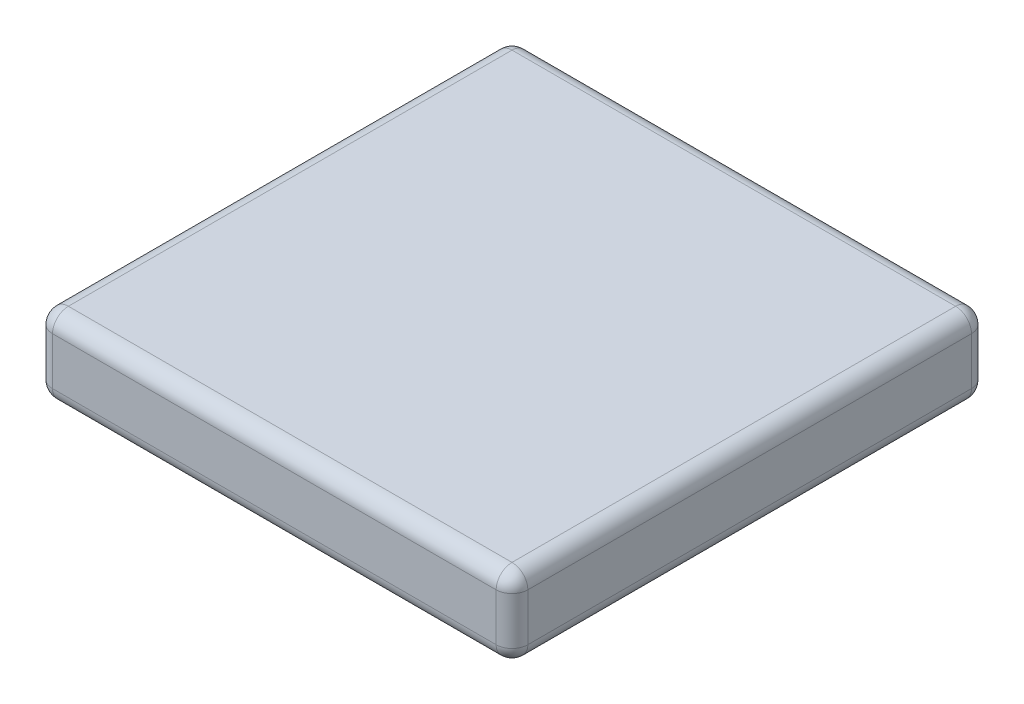
ISO-10303-21;
HEADER;
FILE_DESCRIPTION(('STEP AP214'),'2;1');
FILE_NAME('part.step','',(''),(''),'','','');
FILE_SCHEMA(('AUTOMOTIVE_DESIGN { 1 0 10303 214 1 1 1 1 }'));
ENDSEC;
DATA;
#1=APPLICATION_CONTEXT('core data for automotive mechanical design processes');
#2=APPLICATION_PROTOCOL_DEFINITION('international standard','automotive_design',2000,#1);
#3=PRODUCT_CONTEXT('',#1,'mechanical');
#4=PRODUCT('Part','Part','',(#3));
#5=PRODUCT_RELATED_PRODUCT_CATEGORY('part','',(#4));
#6=PRODUCT_DEFINITION_FORMATION('','',#4);
#7=PRODUCT_DEFINITION_CONTEXT('part definition',#1,'design');
#8=PRODUCT_DEFINITION('design','',#6,#7);
#9=PRODUCT_DEFINITION_SHAPE('','',#8);
#10=(LENGTH_UNIT() NAMED_UNIT(*) SI_UNIT(.MILLI.,.METRE.));
#11=(NAMED_UNIT(*) PLANE_ANGLE_UNIT() SI_UNIT($,.RADIAN.));
#12=(NAMED_UNIT(*) SI_UNIT($,.STERADIAN.) SOLID_ANGLE_UNIT());
#13=UNCERTAINTY_MEASURE_WITH_UNIT(LENGTH_MEASURE(1.E-05),#10,'distance_accuracy_value','');
#14=(GEOMETRIC_REPRESENTATION_CONTEXT(3) GLOBAL_UNCERTAINTY_ASSIGNED_CONTEXT((#13)) GLOBAL_UNIT_ASSIGNED_CONTEXT((#10,
#11,#12)) REPRESENTATION_CONTEXT('',''));
#15=CARTESIAN_POINT('',(0.,0.,0.));
#16=DIRECTION('',(0.,0.,1.));
#17=DIRECTION('',(1.,0.,0.));
#18=AXIS2_PLACEMENT_3D('',#15,#16,#17);
#19=CARTESIAN_POINT('',(0.,5.,0.));
#20=DIRECTION('',(1.,0.,0.));
#21=DIRECTION('',(0.,0.,-1.));
#22=AXIS2_PLACEMENT_3D('',#19,#20,#21);
#23=PLANE('',#22);
#24=DIRECTION('',(0.,-1.,0.));
#25=VECTOR('',#24,1.);
#26=CARTESIAN_POINT('',(0.,5.,1.));
#27=LINE('',#26,#25);
#28=CARTESIAN_POINT('',(0.,4.,1.));
#29=VERTEX_POINT('',#28);
#30=CARTESIAN_POINT('',(0.,1.,1.));
#31=VERTEX_POINT('',#30);
#32=EDGE_CURVE('E180',#29,#31,#27,.T.);
#33=ORIENTED_EDGE('',*,*,#32,.T.);
#34=DIRECTION('',(0.,0.,1.));
#35=VECTOR('',#34,1.);
#36=CARTESIAN_POINT('',(0.,1.,0.));
#37=LINE('',#36,#35);
#38=CARTESIAN_POINT('',(0.,1.,29.));
#39=VERTEX_POINT('',#38);
#40=EDGE_CURVE('E183',#31,#39,#37,.T.);
#41=ORIENTED_EDGE('',*,*,#40,.T.);
#42=DIRECTION('',(0.,-1.,0.));
#43=VECTOR('',#42,1.);
#44=CARTESIAN_POINT('',(0.,5.,29.));
#45=LINE('',#44,#43);
#46=CARTESIAN_POINT('',(0.,4.,29.));
#47=VERTEX_POINT('',#46);
#48=EDGE_CURVE('E178',#39,#47,#45,.F.);
#49=ORIENTED_EDGE('',*,*,#48,.T.);
#50=DIRECTION('',(0.,0.,1.));
#51=VECTOR('',#50,1.);
#52=CARTESIAN_POINT('',(0.,4.,0.));
#53=LINE('',#52,#51);
#54=EDGE_CURVE('E176',#47,#29,#53,.F.);
#55=ORIENTED_EDGE('',*,*,#54,.T.);
#56=EDGE_LOOP('',(#33,#41,#49,#55));
#57=FACE_BOUND('',#56,.T.);
#58=ADVANCED_FACE('F32',(#57),#23,.F.);
#59=CARTESIAN_POINT('',(0.,5.,30.));
#60=DIRECTION('',(0.,0.,-1.));
#61=DIRECTION('',(-1.,0.,0.));
#62=AXIS2_PLACEMENT_3D('',#59,#60,#61);
#63=PLANE('',#62);
#64=DIRECTION('',(1.,0.,0.));
#65=VECTOR('',#64,1.);
#66=CARTESIAN_POINT('',(0.,4.,30.));
#67=LINE('',#66,#65);
#68=CARTESIAN_POINT('',(29.,4.,30.));
#69=VERTEX_POINT('',#68);
#70=CARTESIAN_POINT('',(1.00000000000001,4.,30.));
#71=VERTEX_POINT('',#70);
#72=EDGE_CURVE('E194',#69,#71,#67,.F.);
#73=ORIENTED_EDGE('',*,*,#72,.T.);
#74=DIRECTION('',(0.,-1.,0.));
#75=VECTOR('',#74,1.);
#76=CARTESIAN_POINT('',(1.00000000000001,5.,30.));
#77=LINE('',#76,#75);
#78=CARTESIAN_POINT('',(1.00000000000001,1.,30.));
#79=VERTEX_POINT('',#78);
#80=EDGE_CURVE('E11',#71,#79,#77,.T.);
#81=ORIENTED_EDGE('',*,*,#80,.T.);
#82=DIRECTION('',(1.,0.,0.));
#83=VECTOR('',#82,1.);
#84=CARTESIAN_POINT('',(0.,1.,30.));
#85=LINE('',#84,#83);
#86=CARTESIAN_POINT('',(29.,1.,30.));
#87=VERTEX_POINT('',#86);
#88=EDGE_CURVE('E41',#79,#87,#85,.T.);
#89=ORIENTED_EDGE('',*,*,#88,.T.);
#90=DIRECTION('',(0.,-1.,0.));
#91=VECTOR('',#90,1.);
#92=CARTESIAN_POINT('',(29.,5.,30.));
#93=LINE('',#92,#91);
#94=EDGE_CURVE('E196',#87,#69,#93,.F.);
#95=ORIENTED_EDGE('',*,*,#94,.T.);
#96=EDGE_LOOP('',(#73,#81,#89,#95));
#97=FACE_BOUND('',#96,.T.);
#98=ADVANCED_FACE('F291',(#97),#63,.F.);
#99=CARTESIAN_POINT('',(30.,5.,0.));
#100=DIRECTION('',(-1.,0.,0.));
#101=DIRECTION('',(0.,0.,1.));
#102=AXIS2_PLACEMENT_3D('',#99,#100,#101);
#103=PLANE('',#102);
#104=DIRECTION('',(0.,0.,-1.));
#105=VECTOR('',#104,1.);
#106=CARTESIAN_POINT('',(30.,1.,0.));
#107=LINE('',#106,#105);
#108=CARTESIAN_POINT('',(30.,1.,29.));
#109=VERTEX_POINT('',#108);
#110=CARTESIAN_POINT('',(30.,1.,1.));
#111=VERTEX_POINT('',#110);
#112=EDGE_CURVE('E164',#109,#111,#107,.T.);
#113=ORIENTED_EDGE('',*,*,#112,.T.);
#114=DIRECTION('',(0.,-1.,0.));
#115=VECTOR('',#114,1.);
#116=CARTESIAN_POINT('',(30.,5.,1.));
#117=LINE('',#116,#115);
#118=CARTESIAN_POINT('',(30.,4.,1.));
#119=VERTEX_POINT('',#118);
#120=EDGE_CURVE('E128',#111,#119,#117,.F.);
#121=ORIENTED_EDGE('',*,*,#120,.T.);
#122=DIRECTION('',(0.,0.,-1.));
#123=VECTOR('',#122,1.);
#124=CARTESIAN_POINT('',(30.,4.,30.));
#125=LINE('',#124,#123);
#126=CARTESIAN_POINT('',(30.,4.,29.));
#127=VERTEX_POINT('',#126);
#128=EDGE_CURVE('E156',#119,#127,#125,.F.);
#129=ORIENTED_EDGE('',*,*,#128,.T.);
#130=DIRECTION('',(0.,-1.,0.));
#131=VECTOR('',#130,1.);
#132=CARTESIAN_POINT('',(30.,5.,29.));
#133=LINE('',#132,#131);
#134=EDGE_CURVE('E158',#127,#109,#133,.T.);
#135=ORIENTED_EDGE('',*,*,#134,.T.);
#136=EDGE_LOOP('',(#113,#121,#129,#135));
#137=FACE_BOUND('',#136,.T.);
#138=ADVANCED_FACE('F305',(#137),#103,.F.);
#139=CARTESIAN_POINT('',(0.,5.,0.));
#140=DIRECTION('',(0.,0.,1.));
#141=DIRECTION('',(1.,0.,0.));
#142=AXIS2_PLACEMENT_3D('',#139,#140,#141);
#143=PLANE('',#142);
#144=DIRECTION('',(-1.,0.,0.));
#145=VECTOR('',#144,1.);
#146=CARTESIAN_POINT('',(30.,4.,0.));
#147=LINE('',#146,#145);
#148=CARTESIAN_POINT('',(1.,4.,0.));
#149=VERTEX_POINT('',#148);
#150=CARTESIAN_POINT('',(29.,4.,0.));
#151=VERTEX_POINT('',#150);
#152=EDGE_CURVE('E154',#149,#151,#147,.F.);
#153=ORIENTED_EDGE('',*,*,#152,.T.);
#154=DIRECTION('',(0.,-1.,0.));
#155=VECTOR('',#154,1.);
#156=CARTESIAN_POINT('',(29.,5.,0.));
#157=LINE('',#156,#155);
#158=CARTESIAN_POINT('',(29.,1.,0.));
#159=VERTEX_POINT('',#158);
#160=EDGE_CURVE('E126',#151,#159,#157,.T.);
#161=ORIENTED_EDGE('',*,*,#160,.T.);
#162=DIRECTION('',(-1.,0.,0.));
#163=VECTOR('',#162,1.);
#164=CARTESIAN_POINT('',(0.,1.,0.));
#165=LINE('',#164,#163);
#166=CARTESIAN_POINT('',(1.,1.,0.));
#167=VERTEX_POINT('',#166);
#168=EDGE_CURVE('E144',#159,#167,#165,.T.);
#169=ORIENTED_EDGE('',*,*,#168,.T.);
#170=DIRECTION('',(0.,-1.,0.));
#171=VECTOR('',#170,1.);
#172=CARTESIAN_POINT('',(1.,5.,0.));
#173=LINE('',#172,#171);
#174=EDGE_CURVE('E150',#167,#149,#173,.F.);
#175=ORIENTED_EDGE('',*,*,#174,.T.);
#176=EDGE_LOOP('',(#153,#161,#169,#175));
#177=FACE_BOUND('',#176,.T.);
#178=ADVANCED_FACE('F152',(#177),#143,.F.);
#179=CARTESIAN_POINT('',(0.,5.,0.));
#180=DIRECTION('',(0.,1.,0.));
#181=DIRECTION('',(0.,0.,1.));
#182=AXIS2_PLACEMENT_3D('',#179,#180,#181);
#183=PLANE('',#182);
#184=DIRECTION('',(0.,0.,-1.));
#185=VECTOR('',#184,1.);
#186=CARTESIAN_POINT('',(29.,5.,0.));
#187=LINE('',#186,#185);
#188=CARTESIAN_POINT('',(29.,5.,29.));
#189=VERTEX_POINT('',#188);
#190=CARTESIAN_POINT('',(29.,5.,1.));
#191=VERTEX_POINT('',#190);
#192=EDGE_CURVE('E169',#189,#191,#187,.T.);
#193=ORIENTED_EDGE('',*,*,#192,.T.);
#194=DIRECTION('',(-1.,0.,0.));
#195=VECTOR('',#194,1.);
#196=CARTESIAN_POINT('',(0.,5.,1.));
#197=LINE('',#196,#195);
#198=CARTESIAN_POINT('',(1.,5.,1.));
#199=VERTEX_POINT('',#198);
#200=EDGE_CURVE('E173',#191,#199,#197,.T.);
#201=ORIENTED_EDGE('',*,*,#200,.T.);
#202=DIRECTION('',(0.,0.,1.));
#203=VECTOR('',#202,1.);
#204=CARTESIAN_POINT('',(1.00000000000001,5.,30.));
#205=LINE('',#204,#203);
#206=CARTESIAN_POINT('',(1.00000000000001,5.,29.));
#207=VERTEX_POINT('',#206);
#208=EDGE_CURVE('E171',#199,#207,#205,.T.);
#209=ORIENTED_EDGE('',*,*,#208,.T.);
#210=DIRECTION('',(1.,0.,0.));
#211=VECTOR('',#210,1.);
#212=CARTESIAN_POINT('',(30.,5.,29.));
#213=LINE('',#212,#211);
#214=EDGE_CURVE('E167',#207,#189,#213,.T.);
#215=ORIENTED_EDGE('',*,*,#214,.T.);
#216=EDGE_LOOP('',(#193,#201,#209,#215));
#217=FACE_BOUND('',#216,.T.);
#218=ADVANCED_FACE('F271',(#217),#183,.T.);
#219=CARTESIAN_POINT('',(0.,0.,0.));
#220=DIRECTION('',(0.,1.,0.));
#221=DIRECTION('',(0.,0.,1.));
#222=AXIS2_PLACEMENT_3D('',#219,#220,#221);
#223=PLANE('',#222);
#224=DIRECTION('',(1.,0.,0.));
#225=VECTOR('',#224,1.);
#226=CARTESIAN_POINT('',(0.,0.,29.));
#227=LINE('',#226,#225);
#228=CARTESIAN_POINT('',(29.,0.,29.));
#229=VERTEX_POINT('',#228);
#230=CARTESIAN_POINT('',(1.00000000000001,0.,29.));
#231=VERTEX_POINT('',#230);
#232=EDGE_CURVE('E187',#229,#231,#227,.F.);
#233=ORIENTED_EDGE('',*,*,#232,.T.);
#234=DIRECTION('',(0.,0.,1.));
#235=VECTOR('',#234,1.);
#236=CARTESIAN_POINT('',(1.,0.,0.));
#237=LINE('',#236,#235);
#238=CARTESIAN_POINT('',(1.,0.,1.));
#239=VERTEX_POINT('',#238);
#240=EDGE_CURVE('E192',#231,#239,#237,.F.);
#241=ORIENTED_EDGE('',*,*,#240,.T.);
#242=DIRECTION('',(-1.,0.,0.));
#243=VECTOR('',#242,1.);
#244=CARTESIAN_POINT('',(0.,0.,1.));
#245=LINE('',#244,#243);
#246=CARTESIAN_POINT('',(29.,0.,1.));
#247=VERTEX_POINT('',#246);
#248=EDGE_CURVE('E189',#239,#247,#245,.F.);
#249=ORIENTED_EDGE('',*,*,#248,.T.);
#250=DIRECTION('',(0.,0.,-1.));
#251=VECTOR('',#250,1.);
#252=CARTESIAN_POINT('',(29.,0.,0.));
#253=LINE('',#252,#251);
#254=EDGE_CURVE('E185',#247,#229,#253,.F.);
#255=ORIENTED_EDGE('',*,*,#254,.T.);
#256=EDGE_LOOP('',(#233,#241,#249,#255));
#257=FACE_BOUND('',#256,.T.);
#258=ADVANCED_FACE('F476',(#257),#223,.F.);
#259=CARTESIAN_POINT('',(1.00000000000001,5.,29.));
#260=DIRECTION('',(0.,-1.,0.));
#261=DIRECTION('',(0.,0.,-1.));
#262=AXIS2_PLACEMENT_3D('',#259,#260,#261);
#263=CYLINDRICAL_SURFACE('',#262,1.);
#264=CARTESIAN_POINT('',(1.00000000000001,4.,29.));
#265=DIRECTION('',(0.,1.,0.));
#266=DIRECTION('',(0.,0.,1.));
#267=AXIS2_PLACEMENT_3D('',#264,#265,#266);
#268=CIRCLE('',#267,1.);
#269=EDGE_CURVE('E36',#47,#71,#268,.T.);
#270=ORIENTED_EDGE('',*,*,#269,.F.);
#271=ORIENTED_EDGE('',*,*,#48,.F.);
#272=CARTESIAN_POINT('',(1.00000000000001,1.,29.));
#273=DIRECTION('',(0.,-1.,0.));
#274=DIRECTION('',(0.,0.,-1.));
#275=AXIS2_PLACEMENT_3D('',#272,#273,#274);
#276=CIRCLE('',#275,1.);
#277=EDGE_CURVE('E248',#79,#39,#276,.T.);
#278=ORIENTED_EDGE('',*,*,#277,.F.);
#279=ORIENTED_EDGE('',*,*,#80,.F.);
#280=EDGE_LOOP('',(#270,#271,#278,#279));
#281=FACE_BOUND('',#280,.T.);
#282=ADVANCED_FACE('F34',(#281),#263,.T.);
#283=CARTESIAN_POINT('',(1.00000000000001,4.,29.));
#284=DIRECTION('',(0.,0.,1.));
#285=DIRECTION('',(1.,0.,0.));
#286=AXIS2_PLACEMENT_3D('',#283,#284,#285);
#287=SPHERICAL_SURFACE('',#286,1.);
#288=CARTESIAN_POINT('',(1.00000000000001,4.,29.));
#289=DIRECTION('',(0.,0.,1.));
#290=DIRECTION('',(1.,0.,0.));
#291=AXIS2_PLACEMENT_3D('',#288,#289,#290);
#292=CIRCLE('',#291,1.);
#293=EDGE_CURVE('E243',#47,#207,#292,.F.);
#294=ORIENTED_EDGE('',*,*,#293,.F.);
#295=ORIENTED_EDGE('',*,*,#269,.T.);
#296=CARTESIAN_POINT('',(1.00000000000001,4.,29.));
#297=DIRECTION('',(-1.,0.,0.));
#298=DIRECTION('',(0.,0.,1.));
#299=AXIS2_PLACEMENT_3D('',#296,#297,#298);
#300=CIRCLE('',#299,1.);
#301=EDGE_CURVE('E246',#207,#71,#300,.F.);
#302=ORIENTED_EDGE('',*,*,#301,.F.);
#303=EDGE_LOOP('',(#294,#295,#302));
#304=FACE_BOUND('',#303,.T.);
#305=ADVANCED_FACE('F258',(#304),#287,.T.);
#306=CARTESIAN_POINT('',(1.00000000000001,1.,29.));
#307=DIRECTION('',(-1.,0.,0.));
#308=DIRECTION('',(0.,0.,1.));
#309=AXIS2_PLACEMENT_3D('',#306,#307,#308);
#310=SPHERICAL_SURFACE('',#309,1.);
#311=CARTESIAN_POINT('',(1.00000000000001,1.,29.));
#312=DIRECTION('',(-1.,0.,0.));
#313=DIRECTION('',(0.,0.,1.));
#314=AXIS2_PLACEMENT_3D('',#311,#312,#313);
#315=CIRCLE('',#314,1.);
#316=EDGE_CURVE('E238',#79,#231,#315,.F.);
#317=ORIENTED_EDGE('',*,*,#316,.F.);
#318=ORIENTED_EDGE('',*,*,#277,.T.);
#319=CARTESIAN_POINT('',(1.00000000000001,1.,29.));
#320=DIRECTION('',(0.,0.,1.));
#321=DIRECTION('',(1.,0.,0.));
#322=AXIS2_PLACEMENT_3D('',#319,#320,#321);
#323=CIRCLE('',#322,1.);
#324=EDGE_CURVE('E240',#231,#39,#323,.F.);
#325=ORIENTED_EDGE('',*,*,#324,.F.);
#326=EDGE_LOOP('',(#317,#318,#325));
#327=FACE_BOUND('',#326,.T.);
#328=ADVANCED_FACE('F455',(#327),#310,.T.);
#329=CARTESIAN_POINT('',(0.,4.,29.));
#330=DIRECTION('',(-1.,0.,0.));
#331=DIRECTION('',(0.,0.,1.));
#332=AXIS2_PLACEMENT_3D('',#329,#330,#331);
#333=CYLINDRICAL_SURFACE('',#332,1.);
#334=ORIENTED_EDGE('',*,*,#301,.T.);
#335=ORIENTED_EDGE('',*,*,#72,.F.);
#336=CARTESIAN_POINT('',(29.,4.,29.));
#337=DIRECTION('',(1.,0.,0.));
#338=DIRECTION('',(0.,0.,-1.));
#339=AXIS2_PLACEMENT_3D('',#336,#337,#338);
#340=CIRCLE('',#339,1.);
#341=EDGE_CURVE('E232',#189,#69,#340,.T.);
#342=ORIENTED_EDGE('',*,*,#341,.F.);
#343=ORIENTED_EDGE('',*,*,#214,.F.);
#344=EDGE_LOOP('',(#334,#335,#342,#343));
#345=FACE_BOUND('',#344,.T.);
#346=ADVANCED_FACE('F266',(#345),#333,.T.);
#347=CARTESIAN_POINT('',(1.,4.,0.));
#348=DIRECTION('',(0.,0.,-1.));
#349=DIRECTION('',(-1.,0.,0.));
#350=AXIS2_PLACEMENT_3D('',#347,#348,#349);
#351=CYLINDRICAL_SURFACE('',#350,1.);
#352=ORIENTED_EDGE('',*,*,#293,.T.);
#353=ORIENTED_EDGE('',*,*,#208,.F.);
#354=CARTESIAN_POINT('',(1.,4.,1.));
#355=DIRECTION('',(0.,0.,-1.));
#356=DIRECTION('',(-1.,0.,0.));
#357=AXIS2_PLACEMENT_3D('',#354,#355,#356);
#358=CIRCLE('',#357,1.);
#359=EDGE_CURVE('E229',#29,#199,#358,.T.);
#360=ORIENTED_EDGE('',*,*,#359,.F.);
#361=ORIENTED_EDGE('',*,*,#54,.F.);
#362=EDGE_LOOP('',(#352,#353,#360,#361));
#363=FACE_BOUND('',#362,.T.);
#364=ADVANCED_FACE('F277',(#363),#351,.T.);
#365=CARTESIAN_POINT('',(1.,5.,1.));
#366=DIRECTION('',(0.,-1.,0.));
#367=DIRECTION('',(0.,0.,-1.));
#368=AXIS2_PLACEMENT_3D('',#365,#366,#367);
#369=CYLINDRICAL_SURFACE('',#368,1.);
#370=CARTESIAN_POINT('',(1.,1.,1.));
#371=DIRECTION('',(0.,-1.,0.));
#372=DIRECTION('',(0.,0.,-1.));
#373=AXIS2_PLACEMENT_3D('',#370,#371,#372);
#374=CIRCLE('',#373,1.);
#375=EDGE_CURVE('E223',#31,#167,#374,.T.);
#376=ORIENTED_EDGE('',*,*,#375,.F.);
#377=ORIENTED_EDGE('',*,*,#32,.F.);
#378=CARTESIAN_POINT('',(1.,4.,1.));
#379=DIRECTION('',(0.,1.,0.));
#380=DIRECTION('',(0.,0.,1.));
#381=AXIS2_PLACEMENT_3D('',#378,#379,#380);
#382=CIRCLE('',#381,1.);
#383=EDGE_CURVE('E226',#149,#29,#382,.T.);
#384=ORIENTED_EDGE('',*,*,#383,.F.);
#385=ORIENTED_EDGE('',*,*,#174,.F.);
#386=EDGE_LOOP('',(#376,#377,#384,#385));
#387=FACE_BOUND('',#386,.T.);
#388=ADVANCED_FACE('F283',(#387),#369,.T.);
#389=CARTESIAN_POINT('',(1.,1.,0.));
#390=DIRECTION('',(0.,0.,1.));
#391=DIRECTION('',(1.,0.,0.));
#392=AXIS2_PLACEMENT_3D('',#389,#390,#391);
#393=CYLINDRICAL_SURFACE('',#392,1.);
#394=ORIENTED_EDGE('',*,*,#324,.T.);
#395=ORIENTED_EDGE('',*,*,#40,.F.);
#396=CARTESIAN_POINT('',(1.,1.,1.));
#397=DIRECTION('',(0.,0.,-1.));
#398=DIRECTION('',(-1.,0.,0.));
#399=AXIS2_PLACEMENT_3D('',#396,#397,#398);
#400=CIRCLE('',#399,1.);
#401=EDGE_CURVE('E221',#239,#31,#400,.T.);
#402=ORIENTED_EDGE('',*,*,#401,.F.);
#403=ORIENTED_EDGE('',*,*,#240,.F.);
#404=EDGE_LOOP('',(#394,#395,#402,#403));
#405=FACE_BOUND('',#404,.T.);
#406=ADVANCED_FACE('F289',(#405),#393,.T.);
#407=CARTESIAN_POINT('',(0.,1.,29.));
#408=DIRECTION('',(1.,0.,0.));
#409=DIRECTION('',(0.,0.,-1.));
#410=AXIS2_PLACEMENT_3D('',#407,#408,#409);
#411=CYLINDRICAL_SURFACE('',#410,1.);
#412=ORIENTED_EDGE('',*,*,#316,.T.);
#413=ORIENTED_EDGE('',*,*,#232,.F.);
#414=CARTESIAN_POINT('',(29.,1.,29.));
#415=DIRECTION('',(1.,0.,0.));
#416=DIRECTION('',(0.,0.,-1.));
#417=AXIS2_PLACEMENT_3D('',#414,#415,#416);
#418=CIRCLE('',#417,1.);
#419=EDGE_CURVE('E218',#87,#229,#418,.T.);
#420=ORIENTED_EDGE('',*,*,#419,.F.);
#421=ORIENTED_EDGE('',*,*,#88,.F.);
#422=EDGE_LOOP('',(#412,#413,#420,#421));
#423=FACE_BOUND('',#422,.T.);
#424=ADVANCED_FACE('F298',(#423),#411,.T.);
#425=CARTESIAN_POINT('',(29.,5.,29.));
#426=DIRECTION('',(0.,-1.,0.));
#427=DIRECTION('',(0.,0.,-1.));
#428=AXIS2_PLACEMENT_3D('',#425,#426,#427);
#429=CYLINDRICAL_SURFACE('',#428,1.);
#430=CARTESIAN_POINT('',(29.,4.,29.));
#431=DIRECTION('',(0.,1.,0.));
#432=DIRECTION('',(0.,0.,1.));
#433=AXIS2_PLACEMENT_3D('',#430,#431,#432);
#434=CIRCLE('',#433,1.);
#435=EDGE_CURVE('E235',#69,#127,#434,.T.);
#436=ORIENTED_EDGE('',*,*,#435,.F.);
#437=ORIENTED_EDGE('',*,*,#94,.F.);
#438=CARTESIAN_POINT('',(29.,1.,29.));
#439=DIRECTION('',(0.,-1.,0.));
#440=DIRECTION('',(0.,0.,-1.));
#441=AXIS2_PLACEMENT_3D('',#438,#439,#440);
#442=CIRCLE('',#441,1.);
#443=EDGE_CURVE('E215',#109,#87,#442,.T.);
#444=ORIENTED_EDGE('',*,*,#443,.F.);
#445=ORIENTED_EDGE('',*,*,#134,.F.);
#446=EDGE_LOOP('',(#436,#437,#444,#445));
#447=FACE_BOUND('',#446,.T.);
#448=ADVANCED_FACE('F294',(#447),#429,.T.);
#449=CARTESIAN_POINT('',(29.,4.,29.));
#450=DIRECTION('',(0.,0.,1.));
#451=DIRECTION('',(1.,0.,0.));
#452=AXIS2_PLACEMENT_3D('',#449,#450,#451);
#453=SPHERICAL_SURFACE('',#452,1.);
#454=ORIENTED_EDGE('',*,*,#341,.T.);
#455=ORIENTED_EDGE('',*,*,#435,.T.);
#456=CARTESIAN_POINT('',(29.,4.,29.));
#457=DIRECTION('',(0.,0.,1.));
#458=DIRECTION('',(1.,0.,0.));
#459=AXIS2_PLACEMENT_3D('',#456,#457,#458);
#460=CIRCLE('',#459,1.);
#461=EDGE_CURVE('E212',#189,#127,#460,.F.);
#462=ORIENTED_EDGE('',*,*,#461,.F.);
#463=EDGE_LOOP('',(#454,#455,#462));
#464=FACE_BOUND('',#463,.T.);
#465=ADVANCED_FACE('F308',(#464),#453,.T.);
#466=CARTESIAN_POINT('',(1.,4.,1.));
#467=DIRECTION('',(-1.,0.,0.));
#468=DIRECTION('',(0.,0.,1.));
#469=AXIS2_PLACEMENT_3D('',#466,#467,#468);
#470=SPHERICAL_SURFACE('',#469,1.);
#471=ORIENTED_EDGE('',*,*,#383,.T.);
#472=ORIENTED_EDGE('',*,*,#359,.T.);
#473=CARTESIAN_POINT('',(1.,4.,1.));
#474=DIRECTION('',(-1.,0.,0.));
#475=DIRECTION('',(0.,0.,1.));
#476=AXIS2_PLACEMENT_3D('',#473,#474,#475);
#477=CIRCLE('',#476,1.);
#478=EDGE_CURVE('E210',#149,#199,#477,.F.);
#479=ORIENTED_EDGE('',*,*,#478,.F.);
#480=EDGE_LOOP('',(#471,#472,#479));
#481=FACE_BOUND('',#480,.T.);
#482=ADVANCED_FACE('F318',(#481),#470,.T.);
#483=CARTESIAN_POINT('',(1.,1.,1.));
#484=DIRECTION('',(-1.,0.,0.));
#485=DIRECTION('',(0.,0.,1.));
#486=AXIS2_PLACEMENT_3D('',#483,#484,#485);
#487=SPHERICAL_SURFACE('',#486,1.);
#488=ORIENTED_EDGE('',*,*,#401,.T.);
#489=ORIENTED_EDGE('',*,*,#375,.T.);
#490=CARTESIAN_POINT('',(1.,1.,1.));
#491=DIRECTION('',(-1.,0.,0.));
#492=DIRECTION('',(0.,0.,1.));
#493=AXIS2_PLACEMENT_3D('',#490,#491,#492);
#494=CIRCLE('',#493,1.);
#495=EDGE_CURVE('E147',#239,#167,#494,.F.);
#496=ORIENTED_EDGE('',*,*,#495,.F.);
#497=EDGE_LOOP('',(#488,#489,#496));
#498=FACE_BOUND('',#497,.T.);
#499=ADVANCED_FACE('F320',(#498),#487,.T.);
#500=CARTESIAN_POINT('',(29.,1.,29.));
#501=DIRECTION('',(0.,0.,1.));
#502=DIRECTION('',(1.,0.,0.));
#503=AXIS2_PLACEMENT_3D('',#500,#501,#502);
#504=SPHERICAL_SURFACE('',#503,1.);
#505=ORIENTED_EDGE('',*,*,#443,.T.);
#506=ORIENTED_EDGE('',*,*,#419,.T.);
#507=CARTESIAN_POINT('',(29.,1.,29.));
#508=DIRECTION('',(0.,0.,1.));
#509=DIRECTION('',(1.,0.,0.));
#510=AXIS2_PLACEMENT_3D('',#507,#508,#509);
#511=CIRCLE('',#510,1.);
#512=EDGE_CURVE('E206',#109,#229,#511,.F.);
#513=ORIENTED_EDGE('',*,*,#512,.F.);
#514=EDGE_LOOP('',(#505,#506,#513));
#515=FACE_BOUND('',#514,.T.);
#516=ADVANCED_FACE('F300',(#515),#504,.T.);
#517=CARTESIAN_POINT('',(29.,4.,0.));
#518=DIRECTION('',(0.,0.,1.));
#519=DIRECTION('',(1.,0.,0.));
#520=AXIS2_PLACEMENT_3D('',#517,#518,#519);
#521=CYLINDRICAL_SURFACE('',#520,1.);
#522=ORIENTED_EDGE('',*,*,#461,.T.);
#523=ORIENTED_EDGE('',*,*,#128,.F.);
#524=CARTESIAN_POINT('',(29.,4.,1.));
#525=DIRECTION('',(0.,0.,-1.));
#526=DIRECTION('',(-1.,0.,0.));
#527=AXIS2_PLACEMENT_3D('',#524,#525,#526);
#528=CIRCLE('',#527,1.);
#529=EDGE_CURVE('E203',#191,#119,#528,.T.);
#530=ORIENTED_EDGE('',*,*,#529,.F.);
#531=ORIENTED_EDGE('',*,*,#192,.F.);
#532=EDGE_LOOP('',(#522,#523,#530,#531));
#533=FACE_BOUND('',#532,.T.);
#534=ADVANCED_FACE('F310',(#533),#521,.T.);
#535=CARTESIAN_POINT('',(0.,4.,1.));
#536=DIRECTION('',(1.,0.,0.));
#537=DIRECTION('',(0.,0.,-1.));
#538=AXIS2_PLACEMENT_3D('',#535,#536,#537);
#539=CYLINDRICAL_SURFACE('',#538,1.);
#540=ORIENTED_EDGE('',*,*,#478,.T.);
#541=ORIENTED_EDGE('',*,*,#200,.F.);
#542=CARTESIAN_POINT('',(29.,4.,1.));
#543=DIRECTION('',(1.,0.,0.));
#544=DIRECTION('',(0.,0.,-1.));
#545=AXIS2_PLACEMENT_3D('',#542,#543,#544);
#546=CIRCLE('',#545,1.);
#547=EDGE_CURVE('E141',#151,#191,#546,.T.);
#548=ORIENTED_EDGE('',*,*,#547,.F.);
#549=ORIENTED_EDGE('',*,*,#152,.F.);
#550=EDGE_LOOP('',(#540,#541,#548,#549));
#551=FACE_BOUND('',#550,.T.);
#552=ADVANCED_FACE('F316',(#551),#539,.T.);
#553=CARTESIAN_POINT('',(0.,1.,1.));
#554=DIRECTION('',(-1.,0.,0.));
#555=DIRECTION('',(0.,0.,1.));
#556=AXIS2_PLACEMENT_3D('',#553,#554,#555);
#557=CYLINDRICAL_SURFACE('',#556,1.);
#558=ORIENTED_EDGE('',*,*,#495,.T.);
#559=ORIENTED_EDGE('',*,*,#168,.F.);
#560=CARTESIAN_POINT('',(29.,1.,1.));
#561=DIRECTION('',(1.,0.,0.));
#562=DIRECTION('',(0.,0.,-1.));
#563=AXIS2_PLACEMENT_3D('',#560,#561,#562);
#564=CIRCLE('',#563,1.);
#565=EDGE_CURVE('E133',#247,#159,#564,.T.);
#566=ORIENTED_EDGE('',*,*,#565,.F.);
#567=ORIENTED_EDGE('',*,*,#248,.F.);
#568=EDGE_LOOP('',(#558,#559,#566,#567));
#569=FACE_BOUND('',#568,.T.);
#570=ADVANCED_FACE('F145',(#569),#557,.T.);
#571=CARTESIAN_POINT('',(29.,1.,0.));
#572=DIRECTION('',(0.,0.,-1.));
#573=DIRECTION('',(-1.,0.,0.));
#574=AXIS2_PLACEMENT_3D('',#571,#572,#573);
#575=CYLINDRICAL_SURFACE('',#574,1.);
#576=ORIENTED_EDGE('',*,*,#512,.T.);
#577=ORIENTED_EDGE('',*,*,#254,.F.);
#578=CARTESIAN_POINT('',(29.,1.,1.));
#579=DIRECTION('',(0.,0.,-1.));
#580=DIRECTION('',(-1.,0.,0.));
#581=AXIS2_PLACEMENT_3D('',#578,#579,#580);
#582=CIRCLE('',#581,1.);
#583=EDGE_CURVE('E137',#111,#247,#582,.T.);
#584=ORIENTED_EDGE('',*,*,#583,.F.);
#585=ORIENTED_EDGE('',*,*,#112,.F.);
#586=EDGE_LOOP('',(#576,#577,#584,#585));
#587=FACE_BOUND('',#586,.T.);
#588=ADVANCED_FACE('F303',(#587),#575,.T.);
#589=CARTESIAN_POINT('',(29.,4.,1.));
#590=DIRECTION('',(0.,1.,0.));
#591=DIRECTION('',(0.,0.,1.));
#592=AXIS2_PLACEMENT_3D('',#589,#590,#591);
#593=SPHERICAL_SURFACE('',#592,1.);
#594=ORIENTED_EDGE('',*,*,#547,.T.);
#595=ORIENTED_EDGE('',*,*,#529,.T.);
#596=CARTESIAN_POINT('',(29.,4.,1.));
#597=DIRECTION('',(0.,1.,0.));
#598=DIRECTION('',(0.,0.,1.));
#599=AXIS2_PLACEMENT_3D('',#596,#597,#598);
#600=CIRCLE('',#599,1.);
#601=EDGE_CURVE('E130',#151,#119,#600,.F.);
#602=ORIENTED_EDGE('',*,*,#601,.F.);
#603=EDGE_LOOP('',(#594,#595,#602));
#604=FACE_BOUND('',#603,.T.);
#605=ADVANCED_FACE('F314',(#604),#593,.T.);
#606=CARTESIAN_POINT('',(29.,1.,1.));
#607=DIRECTION('',(0.,-1.,0.));
#608=DIRECTION('',(0.,0.,-1.));
#609=AXIS2_PLACEMENT_3D('',#606,#607,#608);
#610=SPHERICAL_SURFACE('',#609,1.);
#611=ORIENTED_EDGE('',*,*,#583,.T.);
#612=ORIENTED_EDGE('',*,*,#565,.T.);
#613=CARTESIAN_POINT('',(29.,1.,1.));
#614=DIRECTION('',(0.,-1.,0.));
#615=DIRECTION('',(0.,0.,-1.));
#616=AXIS2_PLACEMENT_3D('',#613,#614,#615);
#617=CIRCLE('',#616,1.);
#618=EDGE_CURVE('E122',#111,#159,#617,.F.);
#619=ORIENTED_EDGE('',*,*,#618,.F.);
#620=EDGE_LOOP('',(#611,#612,#619));
#621=FACE_BOUND('',#620,.T.);
#622=ADVANCED_FACE('F135',(#621),#610,.T.);
#623=CARTESIAN_POINT('',(29.,5.,1.));
#624=DIRECTION('',(0.,-1.,0.));
#625=DIRECTION('',(0.,0.,-1.));
#626=AXIS2_PLACEMENT_3D('',#623,#624,#625);
#627=CYLINDRICAL_SURFACE('',#626,1.);
#628=ORIENTED_EDGE('',*,*,#601,.T.);
#629=ORIENTED_EDGE('',*,*,#120,.F.);
#630=ORIENTED_EDGE('',*,*,#618,.T.);
#631=ORIENTED_EDGE('',*,*,#160,.F.);
#632=EDGE_LOOP('',(#628,#629,#630,#631));
#633=FACE_BOUND('',#632,.T.);
#634=ADVANCED_FACE('F124',(#633),#627,.T.);
#635=CLOSED_SHELL('',(#58,#98,#138,#178,#218,#258,#282,#305,#328,#346,#364,#388,#406,#424,#448,
#465,#482,#499,#516,#534,#552,#570,#588,#605,#622,#634));
#636=MANIFOLD_SOLID_BREP('B2',#635);
#637=ADVANCED_BREP_SHAPE_REPRESENTATION('',(#18,#636),#14);
#638=SHAPE_DEFINITION_REPRESENTATION(#9,#637);
ENDSEC;
END-ISO-10303-21;
